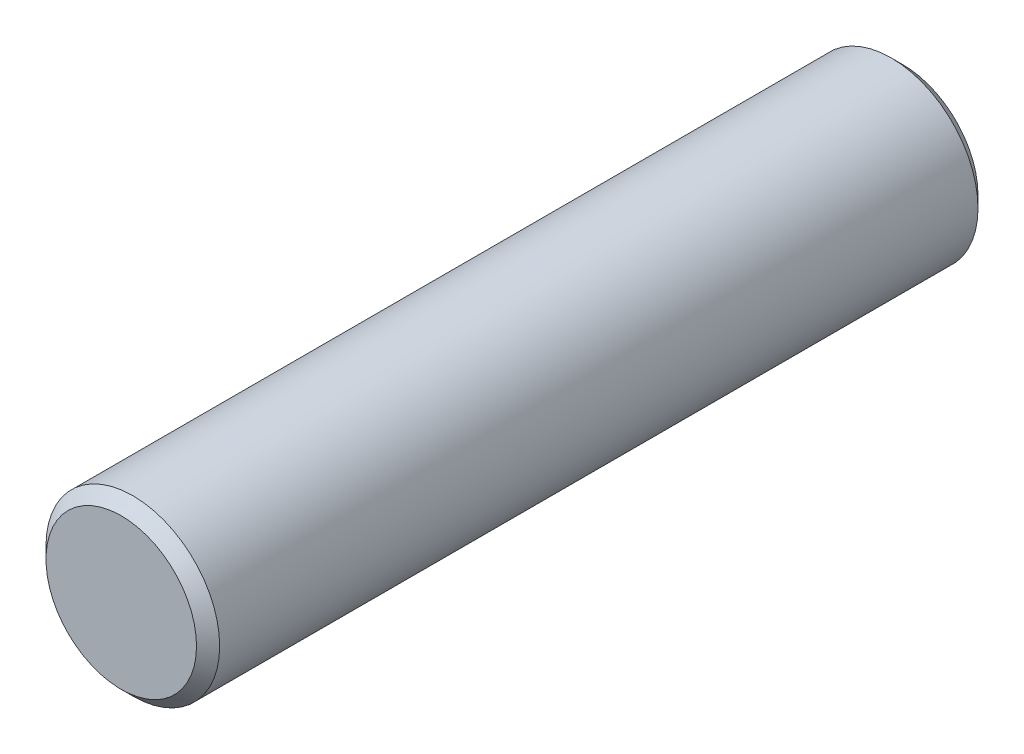
ISO-10303-21;
HEADER;
FILE_DESCRIPTION(('STEP AP214'),'2;1');
FILE_NAME('part.step','',(''),(''),'','','');
FILE_SCHEMA(('AUTOMOTIVE_DESIGN { 1 0 10303 214 1 1 1 1 }'));
ENDSEC;
DATA;
#1=APPLICATION_CONTEXT('core data for automotive mechanical design processes');
#2=APPLICATION_PROTOCOL_DEFINITION('international standard','automotive_design',2000,#1);
#3=PRODUCT_CONTEXT('',#1,'mechanical');
#4=PRODUCT('Part','Part','',(#3));
#5=PRODUCT_RELATED_PRODUCT_CATEGORY('part','',(#4));
#6=PRODUCT_DEFINITION_FORMATION('','',#4);
#7=PRODUCT_DEFINITION_CONTEXT('part definition',#1,'design');
#8=PRODUCT_DEFINITION('design','',#6,#7);
#9=PRODUCT_DEFINITION_SHAPE('','',#8);
#10=(LENGTH_UNIT() NAMED_UNIT(*) SI_UNIT(.MILLI.,.METRE.));
#11=(NAMED_UNIT(*) PLANE_ANGLE_UNIT() SI_UNIT($,.RADIAN.));
#12=(NAMED_UNIT(*) SI_UNIT($,.STERADIAN.) SOLID_ANGLE_UNIT());
#13=UNCERTAINTY_MEASURE_WITH_UNIT(LENGTH_MEASURE(1.E-05),#10,'distance_accuracy_value','');
#14=(GEOMETRIC_REPRESENTATION_CONTEXT(3) GLOBAL_UNCERTAINTY_ASSIGNED_CONTEXT((#13)) GLOBAL_UNIT_ASSIGNED_CONTEXT((#10,
#11,#12)) REPRESENTATION_CONTEXT('',''));
#15=CARTESIAN_POINT('',(0.,0.,0.));
#16=DIRECTION('',(0.,0.,1.));
#17=DIRECTION('',(1.,0.,0.));
#18=AXIS2_PLACEMENT_3D('',#15,#16,#17);
#19=CARTESIAN_POINT('',(0.,0.,6.75));
#20=DIRECTION('',(0.,0.,-1.));
#21=DIRECTION('',(-1.,0.,0.));
#22=AXIS2_PLACEMENT_3D('',#19,#20,#21);
#23=CYLINDRICAL_SURFACE('',#22,1.5);
#24=CARTESIAN_POINT('',(0.,0.,-6.55));
#25=DIRECTION('',(0.,0.,1.));
#26=DIRECTION('',(1.,0.,0.));
#27=AXIS2_PLACEMENT_3D('',#24,#25,#26);
#28=CIRCLE('',#27,1.5);
#29=CARTESIAN_POINT('',(1.5,0.,-6.55));
#30=VERTEX_POINT('',#29);
#31=EDGE_CURVE('E52',#30,#30,#28,.T.);
#32=ORIENTED_EDGE('',*,*,#31,.T.);
#33=EDGE_LOOP('',(#32));
#34=FACE_BOUND('',#33,.T.);
#35=CARTESIAN_POINT('',(0.,0.,6.55));
#36=DIRECTION('',(0.,0.,1.));
#37=DIRECTION('',(1.,0.,0.));
#38=AXIS2_PLACEMENT_3D('',#35,#36,#37);
#39=CIRCLE('',#38,1.5);
#40=CARTESIAN_POINT('',(1.5,0.,6.55));
#41=VERTEX_POINT('',#40);
#42=EDGE_CURVE('E57',#41,#41,#39,.F.);
#43=ORIENTED_EDGE('',*,*,#42,.T.);
#44=EDGE_LOOP('',(#43));
#45=FACE_BOUND('',#44,.T.);
#46=ADVANCED_FACE('F43',(#34,#45),#23,.T.);
#47=CARTESIAN_POINT('',(0.,0.,6.75));
#48=DIRECTION('',(0.,0.,1.));
#49=DIRECTION('',(1.,0.,0.));
#50=AXIS2_PLACEMENT_3D('',#47,#48,#49);
#51=PLANE('',#50);
#52=CARTESIAN_POINT('',(0.,0.,6.75));
#53=DIRECTION('',(0.,0.,1.));
#54=DIRECTION('',(1.,0.,0.));
#55=AXIS2_PLACEMENT_3D('',#52,#53,#54);
#56=CIRCLE('',#55,1.30000000000001);
#57=CARTESIAN_POINT('',(1.30000000000001,0.,6.75));
#58=VERTEX_POINT('',#57);
#59=EDGE_CURVE('E62',#58,#58,#56,.T.);
#60=ORIENTED_EDGE('',*,*,#59,.T.);
#61=EDGE_LOOP('',(#60));
#62=FACE_BOUND('',#61,.T.);
#63=ADVANCED_FACE('F69',(#62),#51,.T.);
#64=CARTESIAN_POINT('',(0.,0.,-6.75));
#65=DIRECTION('',(0.,0.,1.));
#66=DIRECTION('',(1.,0.,0.));
#67=AXIS2_PLACEMENT_3D('',#64,#65,#66);
#68=PLANE('',#67);
#69=CARTESIAN_POINT('',(0.,0.,-6.75));
#70=DIRECTION('',(0.,0.,1.));
#71=DIRECTION('',(1.,0.,0.));
#72=AXIS2_PLACEMENT_3D('',#69,#70,#71);
#73=CIRCLE('',#72,1.3);
#74=CARTESIAN_POINT('',(1.3,0.,-6.75));
#75=VERTEX_POINT('',#74);
#76=EDGE_CURVE('E10',#75,#75,#73,.F.);
#77=ORIENTED_EDGE('',*,*,#76,.T.);
#78=EDGE_LOOP('',(#77));
#79=FACE_BOUND('',#78,.T.);
#80=ADVANCED_FACE('F73',(#79),#68,.F.);
#81=CARTESIAN_POINT('',(0.,0.,6.75));
#82=DIRECTION('',(0.,0.,-1.));
#83=DIRECTION('',(-1.,0.,0.));
#84=AXIS2_PLACEMENT_3D('',#81,#82,#83);
#85=CONICAL_SURFACE('',#84,1.30000000000001,0.785398163397446);
#86=ORIENTED_EDGE('',*,*,#42,.F.);
#87=EDGE_LOOP('',(#86));
#88=FACE_BOUND('',#87,.T.);
#89=ORIENTED_EDGE('',*,*,#59,.F.);
#90=EDGE_LOOP('',(#89));
#91=FACE_BOUND('',#90,.T.);
#92=ADVANCED_FACE('F71',(#88,#91),#85,.T.);
#93=CARTESIAN_POINT('',(0.,0.,-6.55));
#94=DIRECTION('',(0.,0.,1.));
#95=DIRECTION('',(1.,0.,0.));
#96=AXIS2_PLACEMENT_3D('',#93,#94,#95);
#97=CONICAL_SURFACE('',#96,1.5,0.78539816339745);
#98=ORIENTED_EDGE('',*,*,#76,.F.);
#99=EDGE_LOOP('',(#98));
#100=FACE_BOUND('',#99,.T.);
#101=ORIENTED_EDGE('',*,*,#31,.F.);
#102=EDGE_LOOP('',(#101));
#103=FACE_BOUND('',#102,.T.);
#104=ADVANCED_FACE('F46',(#100,#103),#97,.T.);
#105=CLOSED_SHELL('',(#46,#63,#80,#92,#104));
#106=MANIFOLD_SOLID_BREP('B2',#105);
#107=ADVANCED_BREP_SHAPE_REPRESENTATION('',(#18,#106),#14);
#108=SHAPE_DEFINITION_REPRESENTATION(#9,#107);
ENDSEC;
END-ISO-10303-21;
